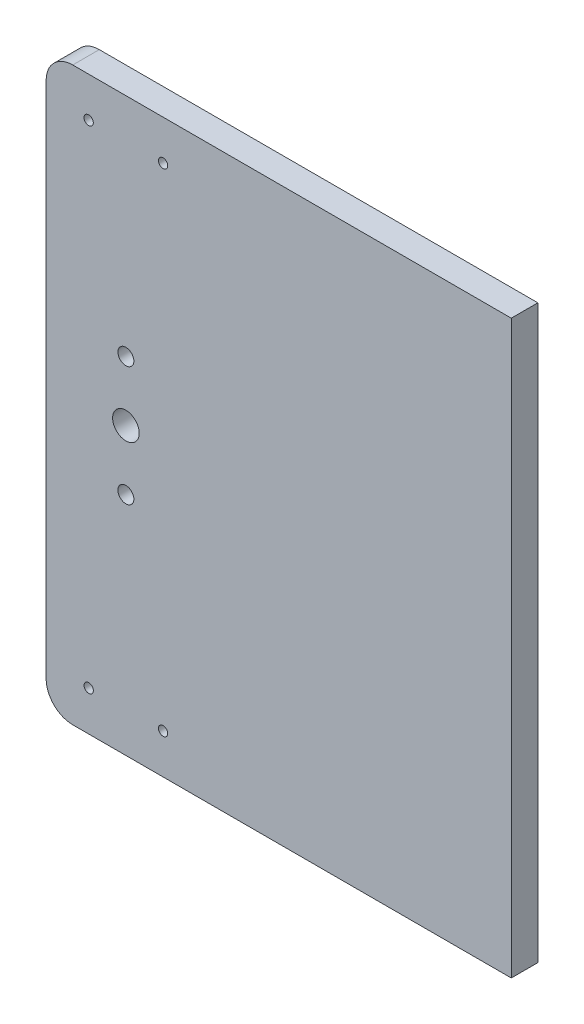
ISO-10303-21;
HEADER;
FILE_DESCRIPTION(('STEP AP214'),'2;1');
FILE_NAME('part.step','',(''),(''),'','','');
FILE_SCHEMA(('AUTOMOTIVE_DESIGN { 1 0 10303 214 1 1 1 1 }'));
ENDSEC;
DATA;
#1=APPLICATION_CONTEXT('core data for automotive mechanical design processes');
#2=APPLICATION_PROTOCOL_DEFINITION('international standard','automotive_design',2000,#1);
#3=PRODUCT_CONTEXT('',#1,'mechanical');
#4=PRODUCT('Part','Part','',(#3));
#5=PRODUCT_RELATED_PRODUCT_CATEGORY('part','',(#4));
#6=PRODUCT_DEFINITION_FORMATION('','',#4);
#7=PRODUCT_DEFINITION_CONTEXT('part definition',#1,'design');
#8=PRODUCT_DEFINITION('design','',#6,#7);
#9=PRODUCT_DEFINITION_SHAPE('','',#8);
#10=(LENGTH_UNIT() NAMED_UNIT(*) SI_UNIT(.MILLI.,.METRE.));
#11=(NAMED_UNIT(*) PLANE_ANGLE_UNIT() SI_UNIT($,.RADIAN.));
#12=(NAMED_UNIT(*) SI_UNIT($,.STERADIAN.) SOLID_ANGLE_UNIT());
#13=UNCERTAINTY_MEASURE_WITH_UNIT(LENGTH_MEASURE(1.E-05),#10,'distance_accuracy_value','');
#14=(GEOMETRIC_REPRESENTATION_CONTEXT(3) GLOBAL_UNCERTAINTY_ASSIGNED_CONTEXT((#13)) GLOBAL_UNIT_ASSIGNED_CONTEXT((#10,
#11,#12)) REPRESENTATION_CONTEXT('',''));
#15=CARTESIAN_POINT('',(0.,0.,0.));
#16=DIRECTION('',(0.,0.,1.));
#17=DIRECTION('',(1.,0.,0.));
#18=AXIS2_PLACEMENT_3D('',#15,#16,#17);
#19=CARTESIAN_POINT('',(0.,215.,20.));
#20=DIRECTION('',(0.,1.,0.));
#21=DIRECTION('',(0.,0.,1.));
#22=AXIS2_PLACEMENT_3D('',#19,#20,#21);
#23=PLANE('',#22);
#24=DIRECTION('',(1.,0.,0.));
#25=VECTOR('',#24,1.);
#26=CARTESIAN_POINT('',(0.,215.,0.));
#27=LINE('',#26,#25);
#28=CARTESIAN_POINT('',(-40.,215.,0.));
#29=VERTEX_POINT('',#28);
#30=CARTESIAN_POINT('',(290.,215.,0.));
#31=VERTEX_POINT('',#30);
#32=EDGE_CURVE('E138',#29,#31,#27,.T.);
#33=ORIENTED_EDGE('',*,*,#32,.F.);
#34=DIRECTION('',(0.,0.,-1.));
#35=VECTOR('',#34,1.);
#36=CARTESIAN_POINT('',(-40.,215.,20.));
#37=LINE('',#36,#35);
#38=CARTESIAN_POINT('',(-40.,215.,20.));
#39=VERTEX_POINT('',#38);
#40=EDGE_CURVE('E60',#29,#39,#37,.F.);
#41=ORIENTED_EDGE('',*,*,#40,.T.);
#42=DIRECTION('',(1.,0.,0.));
#43=VECTOR('',#42,1.);
#44=CARTESIAN_POINT('',(0.,215.,20.));
#45=LINE('',#44,#43);
#46=CARTESIAN_POINT('',(290.,215.,20.));
#47=VERTEX_POINT('',#46);
#48=EDGE_CURVE('E165',#39,#47,#45,.T.);
#49=ORIENTED_EDGE('',*,*,#48,.T.);
#50=DIRECTION('',(0.,0.,-1.));
#51=VECTOR('',#50,1.);
#52=CARTESIAN_POINT('',(290.,215.,20.));
#53=LINE('',#52,#51);
#54=EDGE_CURVE('E109',#47,#31,#53,.T.);
#55=ORIENTED_EDGE('',*,*,#54,.T.);
#56=EDGE_LOOP('',(#33,#41,#49,#55));
#57=FACE_BOUND('',#56,.T.);
#58=ADVANCED_FACE('F37',(#57),#23,.T.);
#59=CARTESIAN_POINT('',(-60.,0.,20.));
#60=DIRECTION('',(1.,0.,0.));
#61=DIRECTION('',(0.,0.,-1.));
#62=AXIS2_PLACEMENT_3D('',#59,#60,#61);
#63=PLANE('',#62);
#64=DIRECTION('',(0.,-1.,0.));
#65=VECTOR('',#64,1.);
#66=CARTESIAN_POINT('',(-60.,0.,20.));
#67=LINE('',#66,#65);
#68=CARTESIAN_POINT('',(-60.,195.,20.));
#69=VERTEX_POINT('',#68);
#70=CARTESIAN_POINT('',(-60.,-195.,20.));
#71=VERTEX_POINT('',#70);
#72=EDGE_CURVE('E98',#69,#71,#67,.T.);
#73=ORIENTED_EDGE('',*,*,#72,.F.);
#74=DIRECTION('',(0.,0.,-1.));
#75=VECTOR('',#74,1.);
#76=CARTESIAN_POINT('',(-60.,195.,0.));
#77=LINE('',#76,#75);
#78=CARTESIAN_POINT('',(-60.,195.,0.));
#79=VERTEX_POINT('',#78);
#80=EDGE_CURVE('E155',#69,#79,#77,.T.);
#81=ORIENTED_EDGE('',*,*,#80,.T.);
#82=DIRECTION('',(0.,-1.,0.));
#83=VECTOR('',#82,1.);
#84=CARTESIAN_POINT('',(-60.,0.,0.));
#85=LINE('',#84,#83);
#86=CARTESIAN_POINT('',(-60.,-195.,0.));
#87=VERTEX_POINT('',#86);
#88=EDGE_CURVE('E140',#79,#87,#85,.T.);
#89=ORIENTED_EDGE('',*,*,#88,.T.);
#90=DIRECTION('',(0.,0.,-1.));
#91=VECTOR('',#90,1.);
#92=CARTESIAN_POINT('',(-60.,-195.,20.));
#93=LINE('',#92,#91);
#94=EDGE_CURVE('E108',#87,#71,#93,.F.);
#95=ORIENTED_EDGE('',*,*,#94,.T.);
#96=EDGE_LOOP('',(#73,#81,#89,#95));
#97=FACE_BOUND('',#96,.T.);
#98=ADVANCED_FACE('F169',(#97),#63,.F.);
#99=CARTESIAN_POINT('',(0.,-215.,20.));
#100=DIRECTION('',(0.,1.,0.));
#101=DIRECTION('',(0.,0.,1.));
#102=AXIS2_PLACEMENT_3D('',#99,#100,#101);
#103=PLANE('',#102);
#104=DIRECTION('',(1.,0.,0.));
#105=VECTOR('',#104,1.);
#106=CARTESIAN_POINT('',(0.,-215.,20.));
#107=LINE('',#106,#105);
#108=CARTESIAN_POINT('',(-40.,-215.,20.));
#109=VERTEX_POINT('',#108);
#110=CARTESIAN_POINT('',(290.,-215.,20.));
#111=VERTEX_POINT('',#110);
#112=EDGE_CURVE('E90',#109,#111,#107,.T.);
#113=ORIENTED_EDGE('',*,*,#112,.F.);
#114=DIRECTION('',(0.,0.,-1.));
#115=VECTOR('',#114,1.);
#116=CARTESIAN_POINT('',(-40.,-215.,20.));
#117=LINE('',#116,#115);
#118=CARTESIAN_POINT('',(-40.,-215.,0.));
#119=VERTEX_POINT('',#118);
#120=EDGE_CURVE('E11',#109,#119,#117,.T.);
#121=ORIENTED_EDGE('',*,*,#120,.T.);
#122=DIRECTION('',(1.,0.,0.));
#123=VECTOR('',#122,1.);
#124=CARTESIAN_POINT('',(0.,-215.,0.));
#125=LINE('',#124,#123);
#126=CARTESIAN_POINT('',(290.,-215.,0.));
#127=VERTEX_POINT('',#126);
#128=EDGE_CURVE('E104',#119,#127,#125,.T.);
#129=ORIENTED_EDGE('',*,*,#128,.T.);
#130=DIRECTION('',(0.,0.,-1.));
#131=VECTOR('',#130,1.);
#132=CARTESIAN_POINT('',(290.,-215.,20.));
#133=LINE('',#132,#131);
#134=EDGE_CURVE('E101',#111,#127,#133,.T.);
#135=ORIENTED_EDGE('',*,*,#134,.F.);
#136=EDGE_LOOP('',(#113,#121,#129,#135));
#137=FACE_BOUND('',#136,.T.);
#138=ADVANCED_FACE('F102',(#137),#103,.F.);
#139=CARTESIAN_POINT('',(28.,-185.,20.));
#140=DIRECTION('',(0.,0.,-1.));
#141=DIRECTION('',(-1.,0.,0.));
#142=AXIS2_PLACEMENT_3D('',#139,#140,#141);
#143=CYLINDRICAL_SURFACE('',#142,3.49999999999999);
#144=CARTESIAN_POINT('',(28.,-185.,20.));
#145=DIRECTION('',(0.,0.,1.));
#146=DIRECTION('',(1.,0.,0.));
#147=AXIS2_PLACEMENT_3D('',#144,#145,#146);
#148=CIRCLE('',#147,3.49999999999999);
#149=CARTESIAN_POINT('',(31.5,-185.,20.));
#150=VERTEX_POINT('',#149);
#151=EDGE_CURVE('E114',#150,#150,#148,.T.);
#152=ORIENTED_EDGE('',*,*,#151,.T.);
#153=EDGE_LOOP('',(#152));
#154=FACE_BOUND('',#153,.T.);
#155=CARTESIAN_POINT('',(28.,-185.,0.));
#156=DIRECTION('',(0.,0.,1.));
#157=DIRECTION('',(1.,0.,0.));
#158=AXIS2_PLACEMENT_3D('',#155,#156,#157);
#159=CIRCLE('',#158,3.49999999999999);
#160=CARTESIAN_POINT('',(31.5,-185.,0.));
#161=VERTEX_POINT('',#160);
#162=EDGE_CURVE('E146',#161,#161,#159,.T.);
#163=ORIENTED_EDGE('',*,*,#162,.F.);
#164=EDGE_LOOP('',(#163));
#165=FACE_BOUND('',#164,.T.);
#166=ADVANCED_FACE('F239',(#154,#165),#143,.F.);
#167=CARTESIAN_POINT('',(290.,0.,20.));
#168=DIRECTION('',(1.,0.,0.));
#169=DIRECTION('',(0.,0.,-1.));
#170=AXIS2_PLACEMENT_3D('',#167,#168,#169);
#171=PLANE('',#170);
#172=DIRECTION('',(0.,-1.,0.));
#173=VECTOR('',#172,1.);
#174=CARTESIAN_POINT('',(290.,0.,0.));
#175=LINE('',#174,#173);
#176=EDGE_CURVE('E144',#31,#127,#175,.T.);
#177=ORIENTED_EDGE('',*,*,#176,.F.);
#178=ORIENTED_EDGE('',*,*,#54,.F.);
#179=DIRECTION('',(0.,-1.,0.));
#180=VECTOR('',#179,1.);
#181=CARTESIAN_POINT('',(290.,0.,20.));
#182=LINE('',#181,#180);
#183=EDGE_CURVE('E95',#47,#111,#182,.T.);
#184=ORIENTED_EDGE('',*,*,#183,.T.);
#185=ORIENTED_EDGE('',*,*,#134,.T.);
#186=EDGE_LOOP('',(#177,#178,#184,#185));
#187=FACE_BOUND('',#186,.T.);
#188=ADVANCED_FACE('F112',(#187),#171,.T.);
#189=CARTESIAN_POINT('',(-28.,185.,20.));
#190=DIRECTION('',(0.,0.,-1.));
#191=DIRECTION('',(-1.,0.,0.));
#192=AXIS2_PLACEMENT_3D('',#189,#190,#191);
#193=CYLINDRICAL_SURFACE('',#192,3.5);
#194=CARTESIAN_POINT('',(-28.,185.,20.));
#195=DIRECTION('',(0.,0.,1.));
#196=DIRECTION('',(1.,0.,0.));
#197=AXIS2_PLACEMENT_3D('',#194,#195,#196);
#198=CIRCLE('',#197,3.5);
#199=CARTESIAN_POINT('',(-24.5,185.,20.));
#200=VERTEX_POINT('',#199);
#201=EDGE_CURVE('E353',#200,#200,#198,.T.);
#202=ORIENTED_EDGE('',*,*,#201,.T.);
#203=EDGE_LOOP('',(#202));
#204=FACE_BOUND('',#203,.T.);
#205=CARTESIAN_POINT('',(-28.,185.,0.));
#206=DIRECTION('',(0.,0.,1.));
#207=DIRECTION('',(1.,0.,0.));
#208=AXIS2_PLACEMENT_3D('',#205,#206,#207);
#209=CIRCLE('',#208,3.5);
#210=CARTESIAN_POINT('',(-24.5,185.,0.));
#211=VERTEX_POINT('',#210);
#212=EDGE_CURVE('E135',#211,#211,#209,.T.);
#213=ORIENTED_EDGE('',*,*,#212,.F.);
#214=EDGE_LOOP('',(#213));
#215=FACE_BOUND('',#214,.T.);
#216=ADVANCED_FACE('F189',(#204,#215),#193,.F.);
#217=CARTESIAN_POINT('',(28.,185.,20.));
#218=DIRECTION('',(0.,0.,-1.));
#219=DIRECTION('',(-1.,0.,0.));
#220=AXIS2_PLACEMENT_3D('',#217,#218,#219);
#221=CYLINDRICAL_SURFACE('',#220,3.49999999999999);
#222=CARTESIAN_POINT('',(28.,185.,20.));
#223=DIRECTION('',(0.,0.,1.));
#224=DIRECTION('',(1.,0.,0.));
#225=AXIS2_PLACEMENT_3D('',#222,#223,#224);
#226=CIRCLE('',#225,3.49999999999999);
#227=CARTESIAN_POINT('',(31.5,185.,20.));
#228=VERTEX_POINT('',#227);
#229=EDGE_CURVE('E350',#228,#228,#226,.F.);
#230=ORIENTED_EDGE('',*,*,#229,.F.);
#231=EDGE_LOOP('',(#230));
#232=FACE_BOUND('',#231,.T.);
#233=CARTESIAN_POINT('',(28.,185.,0.));
#234=DIRECTION('',(0.,0.,1.));
#235=DIRECTION('',(1.,0.,0.));
#236=AXIS2_PLACEMENT_3D('',#233,#234,#235);
#237=CIRCLE('',#236,3.49999999999999);
#238=CARTESIAN_POINT('',(31.5,185.,0.));
#239=VERTEX_POINT('',#238);
#240=EDGE_CURVE('E132',#239,#239,#237,.F.);
#241=ORIENTED_EDGE('',*,*,#240,.T.);
#242=EDGE_LOOP('',(#241));
#243=FACE_BOUND('',#242,.T.);
#244=ADVANCED_FACE('F192',(#232,#243),#221,.F.);
#245=CARTESIAN_POINT('',(0.,0.,20.));
#246=DIRECTION('',(0.,0.,-1.));
#247=DIRECTION('',(-1.,0.,0.));
#248=AXIS2_PLACEMENT_3D('',#245,#246,#247);
#249=CYLINDRICAL_SURFACE('',#248,10.);
#250=CARTESIAN_POINT('',(0.,0.,20.));
#251=DIRECTION('',(0.,0.,1.));
#252=DIRECTION('',(1.,0.,0.));
#253=AXIS2_PLACEMENT_3D('',#250,#251,#252);
#254=CIRCLE('',#253,10.);
#255=CARTESIAN_POINT('',(10.,0.,20.));
#256=VERTEX_POINT('',#255);
#257=EDGE_CURVE('E346',#256,#256,#254,.T.);
#258=ORIENTED_EDGE('',*,*,#257,.T.);
#259=EDGE_LOOP('',(#258));
#260=FACE_BOUND('',#259,.T.);
#261=CARTESIAN_POINT('',(0.,0.,0.));
#262=DIRECTION('',(0.,0.,1.));
#263=DIRECTION('',(1.,0.,0.));
#264=AXIS2_PLACEMENT_3D('',#261,#262,#263);
#265=CIRCLE('',#264,10.);
#266=CARTESIAN_POINT('',(10.,0.,0.));
#267=VERTEX_POINT('',#266);
#268=EDGE_CURVE('E129',#267,#267,#265,.T.);
#269=ORIENTED_EDGE('',*,*,#268,.F.);
#270=EDGE_LOOP('',(#269));
#271=FACE_BOUND('',#270,.T.);
#272=ADVANCED_FACE('F196',(#260,#271),#249,.F.);
#273=CARTESIAN_POINT('',(0.,45.,20.));
#274=DIRECTION('',(0.,0.,-1.));
#275=DIRECTION('',(-1.,0.,0.));
#276=AXIS2_PLACEMENT_3D('',#273,#274,#275);
#277=CYLINDRICAL_SURFACE('',#276,6.);
#278=CARTESIAN_POINT('',(0.,45.,20.));
#279=DIRECTION('',(0.,0.,1.));
#280=DIRECTION('',(1.,0.,0.));
#281=AXIS2_PLACEMENT_3D('',#278,#279,#280);
#282=CIRCLE('',#281,6.);
#283=CARTESIAN_POINT('',(6.,45.,20.));
#284=VERTEX_POINT('',#283);
#285=EDGE_CURVE('E342',#284,#284,#282,.T.);
#286=ORIENTED_EDGE('',*,*,#285,.T.);
#287=EDGE_LOOP('',(#286));
#288=FACE_BOUND('',#287,.T.);
#289=CARTESIAN_POINT('',(0.,45.,0.));
#290=DIRECTION('',(0.,0.,1.));
#291=DIRECTION('',(1.,0.,0.));
#292=AXIS2_PLACEMENT_3D('',#289,#290,#291);
#293=CIRCLE('',#292,6.);
#294=CARTESIAN_POINT('',(6.,45.,0.));
#295=VERTEX_POINT('',#294);
#296=EDGE_CURVE('E126',#295,#295,#293,.T.);
#297=ORIENTED_EDGE('',*,*,#296,.F.);
#298=EDGE_LOOP('',(#297));
#299=FACE_BOUND('',#298,.T.);
#300=ADVANCED_FACE('F200',(#288,#299),#277,.F.);
#301=CARTESIAN_POINT('',(0.,-45.,20.));
#302=DIRECTION('',(0.,0.,-1.));
#303=DIRECTION('',(-1.,0.,0.));
#304=AXIS2_PLACEMENT_3D('',#301,#302,#303);
#305=CYLINDRICAL_SURFACE('',#304,6.);
#306=CARTESIAN_POINT('',(0.,-45.,20.));
#307=DIRECTION('',(0.,0.,1.));
#308=DIRECTION('',(1.,0.,0.));
#309=AXIS2_PLACEMENT_3D('',#306,#307,#308);
#310=CIRCLE('',#309,6.);
#311=CARTESIAN_POINT('',(6.,-45.,20.));
#312=VERTEX_POINT('',#311);
#313=EDGE_CURVE('E152',#312,#312,#310,.T.);
#314=ORIENTED_EDGE('',*,*,#313,.T.);
#315=EDGE_LOOP('',(#314));
#316=FACE_BOUND('',#315,.T.);
#317=CARTESIAN_POINT('',(0.,-45.,0.));
#318=DIRECTION('',(0.,0.,1.));
#319=DIRECTION('',(1.,0.,0.));
#320=AXIS2_PLACEMENT_3D('',#317,#318,#319);
#321=CIRCLE('',#320,6.);
#322=CARTESIAN_POINT('',(6.,-45.,0.));
#323=VERTEX_POINT('',#322);
#324=EDGE_CURVE('E123',#323,#323,#321,.T.);
#325=ORIENTED_EDGE('',*,*,#324,.F.);
#326=EDGE_LOOP('',(#325));
#327=FACE_BOUND('',#326,.T.);
#328=ADVANCED_FACE('F204',(#316,#327),#305,.F.);
#329=CARTESIAN_POINT('',(-28.,-185.,20.));
#330=DIRECTION('',(0.,0.,-1.));
#331=DIRECTION('',(-1.,0.,0.));
#332=AXIS2_PLACEMENT_3D('',#329,#330,#331);
#333=CYLINDRICAL_SURFACE('',#332,3.49999999999999);
#334=CARTESIAN_POINT('',(-28.,-185.,20.));
#335=DIRECTION('',(0.,0.,1.));
#336=DIRECTION('',(1.,0.,0.));
#337=AXIS2_PLACEMENT_3D('',#334,#335,#336);
#338=CIRCLE('',#337,3.49999999999999);
#339=CARTESIAN_POINT('',(-24.5,-185.,20.));
#340=VERTEX_POINT('',#339);
#341=EDGE_CURVE('E117',#340,#340,#338,.F.);
#342=ORIENTED_EDGE('',*,*,#341,.F.);
#343=EDGE_LOOP('',(#342));
#344=FACE_BOUND('',#343,.T.);
#345=CARTESIAN_POINT('',(-28.,-185.,0.));
#346=DIRECTION('',(0.,0.,1.));
#347=DIRECTION('',(1.,0.,0.));
#348=AXIS2_PLACEMENT_3D('',#345,#346,#347);
#349=CIRCLE('',#348,3.49999999999999);
#350=CARTESIAN_POINT('',(-24.5,-185.,0.));
#351=VERTEX_POINT('',#350);
#352=EDGE_CURVE('E149',#351,#351,#349,.F.);
#353=ORIENTED_EDGE('',*,*,#352,.T.);
#354=EDGE_LOOP('',(#353));
#355=FACE_BOUND('',#354,.T.);
#356=ADVANCED_FACE('F207',(#344,#355),#333,.F.);
#357=CARTESIAN_POINT('',(0.,0.,20.));
#358=DIRECTION('',(0.,0.,1.));
#359=DIRECTION('',(1.,0.,0.));
#360=AXIS2_PLACEMENT_3D('',#357,#358,#359);
#361=PLANE('',#360);
#362=ORIENTED_EDGE('',*,*,#313,.F.);
#363=EDGE_LOOP('',(#362));
#364=FACE_BOUND('',#363,.T.);
#365=ORIENTED_EDGE('',*,*,#285,.F.);
#366=EDGE_LOOP('',(#365));
#367=FACE_BOUND('',#366,.T.);
#368=ORIENTED_EDGE('',*,*,#257,.F.);
#369=EDGE_LOOP('',(#368));
#370=FACE_BOUND('',#369,.T.);
#371=ORIENTED_EDGE('',*,*,#229,.T.);
#372=EDGE_LOOP('',(#371));
#373=FACE_BOUND('',#372,.T.);
#374=ORIENTED_EDGE('',*,*,#201,.F.);
#375=EDGE_LOOP('',(#374));
#376=FACE_BOUND('',#375,.T.);
#377=ORIENTED_EDGE('',*,*,#48,.F.);
#378=CARTESIAN_POINT('',(-40.,195.,20.));
#379=DIRECTION('',(0.,0.,1.));
#380=DIRECTION('',(1.,0.,0.));
#381=AXIS2_PLACEMENT_3D('',#378,#379,#380);
#382=CIRCLE('',#381,20.);
#383=EDGE_CURVE('E45',#39,#69,#382,.T.);
#384=ORIENTED_EDGE('',*,*,#383,.T.);
#385=ORIENTED_EDGE('',*,*,#72,.T.);
#386=CARTESIAN_POINT('',(-40.,-195.,20.));
#387=DIRECTION('',(0.,0.,1.));
#388=DIRECTION('',(1.,0.,0.));
#389=AXIS2_PLACEMENT_3D('',#386,#387,#388);
#390=CIRCLE('',#389,20.);
#391=EDGE_CURVE('E52',#71,#109,#390,.T.);
#392=ORIENTED_EDGE('',*,*,#391,.T.);
#393=ORIENTED_EDGE('',*,*,#112,.T.);
#394=ORIENTED_EDGE('',*,*,#183,.F.);
#395=EDGE_LOOP('',(#377,#384,#385,#392,#393,#394));
#396=FACE_BOUND('',#395,.T.);
#397=ORIENTED_EDGE('',*,*,#151,.F.);
#398=EDGE_LOOP('',(#397));
#399=FACE_BOUND('',#398,.T.);
#400=ORIENTED_EDGE('',*,*,#341,.T.);
#401=EDGE_LOOP('',(#400));
#402=FACE_BOUND('',#401,.T.);
#403=ADVANCED_FACE('F92',(#364,#367,#370,#373,#376,#396,#399,#402),#361,.T.);
#404=CARTESIAN_POINT('',(0.,0.,0.));
#405=DIRECTION('',(0.,0.,1.));
#406=DIRECTION('',(1.,0.,0.));
#407=AXIS2_PLACEMENT_3D('',#404,#405,#406);
#408=PLANE('',#407);
#409=ORIENTED_EDGE('',*,*,#324,.T.);
#410=EDGE_LOOP('',(#409));
#411=FACE_BOUND('',#410,.T.);
#412=ORIENTED_EDGE('',*,*,#296,.T.);
#413=EDGE_LOOP('',(#412));
#414=FACE_BOUND('',#413,.T.);
#415=ORIENTED_EDGE('',*,*,#268,.T.);
#416=EDGE_LOOP('',(#415));
#417=FACE_BOUND('',#416,.T.);
#418=ORIENTED_EDGE('',*,*,#240,.F.);
#419=EDGE_LOOP('',(#418));
#420=FACE_BOUND('',#419,.T.);
#421=ORIENTED_EDGE('',*,*,#212,.T.);
#422=EDGE_LOOP('',(#421));
#423=FACE_BOUND('',#422,.T.);
#424=ORIENTED_EDGE('',*,*,#88,.F.);
#425=CARTESIAN_POINT('',(-40.,195.,0.));
#426=DIRECTION('',(0.,0.,1.));
#427=DIRECTION('',(1.,0.,0.));
#428=AXIS2_PLACEMENT_3D('',#425,#426,#427);
#429=CIRCLE('',#428,20.);
#430=EDGE_CURVE('E160',#79,#29,#429,.F.);
#431=ORIENTED_EDGE('',*,*,#430,.T.);
#432=ORIENTED_EDGE('',*,*,#32,.T.);
#433=ORIENTED_EDGE('',*,*,#176,.T.);
#434=ORIENTED_EDGE('',*,*,#128,.F.);
#435=CARTESIAN_POINT('',(-40.,-195.,0.));
#436=DIRECTION('',(0.,0.,1.));
#437=DIRECTION('',(1.,0.,0.));
#438=AXIS2_PLACEMENT_3D('',#435,#436,#437);
#439=CIRCLE('',#438,20.);
#440=EDGE_CURVE('E158',#119,#87,#439,.F.);
#441=ORIENTED_EDGE('',*,*,#440,.T.);
#442=EDGE_LOOP('',(#424,#431,#432,#433,#434,#441));
#443=FACE_BOUND('',#442,.T.);
#444=ORIENTED_EDGE('',*,*,#162,.T.);
#445=EDGE_LOOP('',(#444));
#446=FACE_BOUND('',#445,.T.);
#447=ORIENTED_EDGE('',*,*,#352,.F.);
#448=EDGE_LOOP('',(#447));
#449=FACE_BOUND('',#448,.T.);
#450=ADVANCED_FACE('F174',(#411,#414,#417,#420,#423,#443,#446,#449),#408,.F.);
#451=CARTESIAN_POINT('',(-40.,195.,20.));
#452=DIRECTION('',(0.,0.,1.));
#453=DIRECTION('',(1.,0.,0.));
#454=AXIS2_PLACEMENT_3D('',#451,#452,#453);
#455=CYLINDRICAL_SURFACE('',#454,20.);
#456=ORIENTED_EDGE('',*,*,#383,.F.);
#457=ORIENTED_EDGE('',*,*,#40,.F.);
#458=ORIENTED_EDGE('',*,*,#430,.F.);
#459=ORIENTED_EDGE('',*,*,#80,.F.);
#460=EDGE_LOOP('',(#456,#457,#458,#459));
#461=FACE_BOUND('',#460,.T.);
#462=ADVANCED_FACE('F172',(#461),#455,.T.);
#463=CARTESIAN_POINT('',(-40.,-195.,20.));
#464=DIRECTION('',(0.,0.,-1.));
#465=DIRECTION('',(-1.,0.,0.));
#466=AXIS2_PLACEMENT_3D('',#463,#464,#465);
#467=CYLINDRICAL_SURFACE('',#466,20.);
#468=ORIENTED_EDGE('',*,*,#391,.F.);
#469=ORIENTED_EDGE('',*,*,#94,.F.);
#470=ORIENTED_EDGE('',*,*,#440,.F.);
#471=ORIENTED_EDGE('',*,*,#120,.F.);
#472=EDGE_LOOP('',(#468,#469,#470,#471));
#473=FACE_BOUND('',#472,.T.);
#474=ADVANCED_FACE('F39',(#473),#467,.T.);
#475=CLOSED_SHELL('',(#58,#98,#138,#166,#188,#216,#244,#272,#300,#328,#356,#403,#450,#462,#474));
#476=MANIFOLD_SOLID_BREP('B2',#475);
#477=ADVANCED_BREP_SHAPE_REPRESENTATION('',(#18,#476),#14);
#478=SHAPE_DEFINITION_REPRESENTATION(#9,#477);
ENDSEC;
END-ISO-10303-21;
